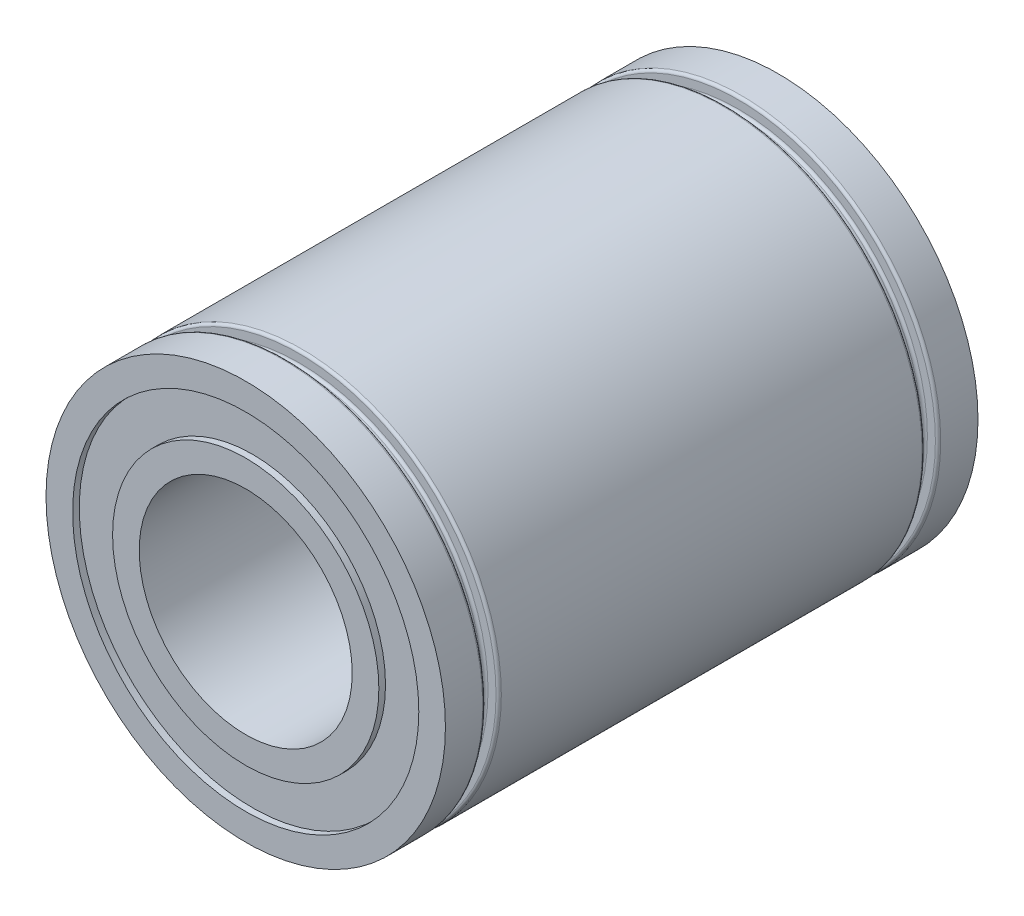
ISO-10303-21;
HEADER;
FILE_DESCRIPTION(('STEP AP214'),'2;1');
FILE_NAME('part.step','',(''),(''),'','','');
FILE_SCHEMA(('AUTOMOTIVE_DESIGN { 1 0 10303 214 1 1 1 1 }'));
ENDSEC;
DATA;
#1=APPLICATION_CONTEXT('core data for automotive mechanical design processes');
#2=APPLICATION_PROTOCOL_DEFINITION('international standard','automotive_design',2000,#1);
#3=PRODUCT_CONTEXT('',#1,'mechanical');
#4=PRODUCT('Part','Part','',(#3));
#5=PRODUCT_RELATED_PRODUCT_CATEGORY('part','',(#4));
#6=PRODUCT_DEFINITION_FORMATION('','',#4);
#7=PRODUCT_DEFINITION_CONTEXT('part definition',#1,'design');
#8=PRODUCT_DEFINITION('design','',#6,#7);
#9=PRODUCT_DEFINITION_SHAPE('','',#8);
#10=(LENGTH_UNIT() NAMED_UNIT(*) SI_UNIT(.MILLI.,.METRE.));
#11=(NAMED_UNIT(*) PLANE_ANGLE_UNIT() SI_UNIT($,.RADIAN.));
#12=(NAMED_UNIT(*) SI_UNIT($,.STERADIAN.) SOLID_ANGLE_UNIT());
#13=UNCERTAINTY_MEASURE_WITH_UNIT(LENGTH_MEASURE(1.E-05),#10,'distance_accuracy_value','');
#14=(GEOMETRIC_REPRESENTATION_CONTEXT(3) GLOBAL_UNCERTAINTY_ASSIGNED_CONTEXT((#13)) GLOBAL_UNIT_ASSIGNED_CONTEXT((#10,
#11,#12)) REPRESENTATION_CONTEXT('',''));
#15=CARTESIAN_POINT('',(0.,0.,0.));
#16=DIRECTION('',(0.,0.,1.));
#17=DIRECTION('',(1.,0.,0.));
#18=AXIS2_PLACEMENT_3D('',#15,#16,#17);
#19=CARTESIAN_POINT('',(0.,0.,10.));
#20=DIRECTION('',(0.,0.,-1.));
#21=DIRECTION('',(-1.,0.,0.));
#22=AXIS2_PLACEMENT_3D('',#19,#20,#21);
#23=CYLINDRICAL_SURFACE('',#22,7.5);
#24=CARTESIAN_POINT('',(0.,0.,-8.6));
#25=DIRECTION('',(0.,0.,1.));
#26=DIRECTION('',(1.,0.,0.));
#27=AXIS2_PLACEMENT_3D('',#24,#25,#26);
#28=CIRCLE('',#27,7.5);
#29=CARTESIAN_POINT('',(7.5,0.,-8.6));
#30=VERTEX_POINT('',#29);
#31=EDGE_CURVE('E84',#30,#30,#28,.F.);
#32=ORIENTED_EDGE('',*,*,#31,.T.);
#33=EDGE_LOOP('',(#32));
#34=FACE_BOUND('',#33,.T.);
#35=CARTESIAN_POINT('',(0.,0.,-10.));
#36=DIRECTION('',(0.,0.,1.));
#37=DIRECTION('',(1.,0.,0.));
#38=AXIS2_PLACEMENT_3D('',#35,#36,#37);
#39=CIRCLE('',#38,7.5);
#40=CARTESIAN_POINT('',(7.5,0.,-10.));
#41=VERTEX_POINT('',#40);
#42=EDGE_CURVE('E124',#41,#41,#39,.T.);
#43=ORIENTED_EDGE('',*,*,#42,.T.);
#44=EDGE_LOOP('',(#43));
#45=FACE_BOUND('',#44,.T.);
#46=ADVANCED_FACE('F43',(#34,#45),#23,.T.);
#47=CARTESIAN_POINT('',(0.,0.,8.6));
#48=DIRECTION('',(0.,0.,-1.));
#49=DIRECTION('',(-1.,0.,0.));
#50=AXIS2_PLACEMENT_3D('',#47,#48,#49);
#51=CIRCLE('',#50,7.5);
#52=CARTESIAN_POINT('',(-7.5,0.,8.6));
#53=VERTEX_POINT('',#52);
#54=EDGE_CURVE('E11',#53,#53,#51,.F.);
#55=ORIENTED_EDGE('',*,*,#54,.T.);
#56=EDGE_LOOP('',(#55));
#57=FACE_BOUND('',#56,.T.);
#58=CARTESIAN_POINT('',(0.,0.,10.));
#59=DIRECTION('',(0.,0.,1.));
#60=DIRECTION('',(1.,0.,0.));
#61=AXIS2_PLACEMENT_3D('',#58,#59,#60);
#62=CIRCLE('',#61,7.5);
#63=CARTESIAN_POINT('',(7.5,0.,10.));
#64=VERTEX_POINT('',#63);
#65=EDGE_CURVE('E123',#64,#64,#62,.T.);
#66=ORIENTED_EDGE('',*,*,#65,.F.);
#67=EDGE_LOOP('',(#66));
#68=FACE_BOUND('',#67,.T.);
#69=ADVANCED_FACE('F145',(#57,#68),#23,.T.);
#70=CARTESIAN_POINT('',(0.,0.,10.));
#71=DIRECTION('',(0.,0.,-1.));
#72=DIRECTION('',(-1.,0.,0.));
#73=AXIS2_PLACEMENT_3D('',#70,#71,#72);
#74=CYLINDRICAL_SURFACE('',#73,5.);
#75=CARTESIAN_POINT('',(0.,0.,-10.));
#76=DIRECTION('',(0.,0.,1.));
#77=DIRECTION('',(1.,0.,0.));
#78=AXIS2_PLACEMENT_3D('',#75,#76,#77);
#79=CIRCLE('',#78,5.);
#80=CARTESIAN_POINT('',(5.,0.,-10.));
#81=VERTEX_POINT('',#80);
#82=EDGE_CURVE('E103',#81,#81,#79,.T.);
#83=ORIENTED_EDGE('',*,*,#82,.T.);
#84=EDGE_LOOP('',(#83));
#85=FACE_BOUND('',#84,.T.);
#86=CARTESIAN_POINT('',(0.,0.,-9.75));
#87=DIRECTION('',(0.,0.,1.));
#88=DIRECTION('',(1.,0.,0.));
#89=AXIS2_PLACEMENT_3D('',#86,#87,#88);
#90=CIRCLE('',#89,5.);
#91=CARTESIAN_POINT('',(5.,0.,-9.75));
#92=VERTEX_POINT('',#91);
#93=EDGE_CURVE('E99',#92,#92,#90,.T.);
#94=ORIENTED_EDGE('',*,*,#93,.F.);
#95=EDGE_LOOP('',(#94));
#96=FACE_BOUND('',#95,.T.);
#97=ADVANCED_FACE('F147',(#85,#96),#74,.T.);
#98=CARTESIAN_POINT('',(0.,0.,10.));
#99=DIRECTION('',(0.,0.,-1.));
#100=DIRECTION('',(-1.,0.,0.));
#101=AXIS2_PLACEMENT_3D('',#98,#99,#100);
#102=CYLINDRICAL_SURFACE('',#101,4.);
#103=CARTESIAN_POINT('',(0.,0.,10.));
#104=DIRECTION('',(0.,0.,1.));
#105=DIRECTION('',(1.,0.,0.));
#106=AXIS2_PLACEMENT_3D('',#103,#104,#105);
#107=CIRCLE('',#106,4.);
#108=CARTESIAN_POINT('',(4.,0.,10.));
#109=VERTEX_POINT('',#108);
#110=EDGE_CURVE('E106',#109,#109,#107,.T.);
#111=ORIENTED_EDGE('',*,*,#110,.T.);
#112=EDGE_LOOP('',(#111));
#113=FACE_BOUND('',#112,.T.);
#114=CARTESIAN_POINT('',(0.,0.,-10.));
#115=DIRECTION('',(0.,0.,1.));
#116=DIRECTION('',(1.,0.,0.));
#117=AXIS2_PLACEMENT_3D('',#114,#115,#116);
#118=CIRCLE('',#117,4.);
#119=CARTESIAN_POINT('',(4.,0.,-10.));
#120=VERTEX_POINT('',#119);
#121=EDGE_CURVE('E107',#120,#120,#118,.T.);
#122=ORIENTED_EDGE('',*,*,#121,.F.);
#123=EDGE_LOOP('',(#122));
#124=FACE_BOUND('',#123,.T.);
#125=ADVANCED_FACE('F154',(#113,#124),#102,.F.);
#126=CARTESIAN_POINT('',(0.,0.,9.75));
#127=DIRECTION('',(0.,0.,1.));
#128=DIRECTION('',(1.,0.,0.));
#129=AXIS2_PLACEMENT_3D('',#126,#127,#128);
#130=CIRCLE('',#129,5.);
#131=CARTESIAN_POINT('',(5.,0.,9.75));
#132=VERTEX_POINT('',#131);
#133=EDGE_CURVE('E110',#132,#132,#130,.T.);
#134=ORIENTED_EDGE('',*,*,#133,.T.);
#135=EDGE_LOOP('',(#134));
#136=FACE_BOUND('',#135,.T.);
#137=CARTESIAN_POINT('',(0.,0.,10.));
#138=DIRECTION('',(0.,0.,1.));
#139=DIRECTION('',(1.,0.,0.));
#140=AXIS2_PLACEMENT_3D('',#137,#138,#139);
#141=CIRCLE('',#140,5.);
#142=CARTESIAN_POINT('',(5.,0.,10.));
#143=VERTEX_POINT('',#142);
#144=EDGE_CURVE('E102',#143,#143,#141,.T.);
#145=ORIENTED_EDGE('',*,*,#144,.F.);
#146=EDGE_LOOP('',(#145));
#147=FACE_BOUND('',#146,.T.);
#148=ADVANCED_FACE('F157',(#136,#147),#74,.T.);
#149=CARTESIAN_POINT('',(0.,0.,10.));
#150=DIRECTION('',(0.,0.,1.));
#151=DIRECTION('',(1.,0.,0.));
#152=AXIS2_PLACEMENT_3D('',#149,#150,#151);
#153=PLANE('',#152);
#154=ORIENTED_EDGE('',*,*,#110,.F.);
#155=EDGE_LOOP('',(#154));
#156=FACE_BOUND('',#155,.T.);
#157=ORIENTED_EDGE('',*,*,#144,.T.);
#158=EDGE_LOOP('',(#157));
#159=FACE_BOUND('',#158,.T.);
#160=ADVANCED_FACE('F378',(#156,#159),#153,.T.);
#161=CARTESIAN_POINT('',(0.,0.,-10.));
#162=DIRECTION('',(0.,0.,1.));
#163=DIRECTION('',(1.,0.,0.));
#164=AXIS2_PLACEMENT_3D('',#161,#162,#163);
#165=PLANE('',#164);
#166=ORIENTED_EDGE('',*,*,#121,.T.);
#167=EDGE_LOOP('',(#166));
#168=FACE_BOUND('',#167,.T.);
#169=ORIENTED_EDGE('',*,*,#82,.F.);
#170=EDGE_LOOP('',(#169));
#171=FACE_BOUND('',#170,.T.);
#172=ADVANCED_FACE('F341',(#168,#171),#165,.F.);
#173=CARTESIAN_POINT('',(0.,0.,9.75));
#174=DIRECTION('',(0.,0.,1.));
#175=DIRECTION('',(1.,0.,0.));
#176=AXIS2_PLACEMENT_3D('',#173,#174,#175);
#177=PLANE('',#176);
#178=ORIENTED_EDGE('',*,*,#133,.F.);
#179=EDGE_LOOP('',(#178));
#180=FACE_BOUND('',#179,.T.);
#181=CARTESIAN_POINT('',(0.,0.,9.75));
#182=DIRECTION('',(0.,0.,1.));
#183=DIRECTION('',(1.,0.,0.));
#184=AXIS2_PLACEMENT_3D('',#181,#182,#183);
#185=CIRCLE('',#184,6.5);
#186=CARTESIAN_POINT('',(6.5,0.,9.75));
#187=VERTEX_POINT('',#186);
#188=EDGE_CURVE('E118',#187,#187,#185,.F.);
#189=ORIENTED_EDGE('',*,*,#188,.F.);
#190=EDGE_LOOP('',(#189));
#191=FACE_BOUND('',#190,.T.);
#192=ADVANCED_FACE('F331',(#180,#191),#177,.T.);
#193=CARTESIAN_POINT('',(0.,0.,-9.75));
#194=DIRECTION('',(0.,0.,1.));
#195=DIRECTION('',(1.,0.,0.));
#196=AXIS2_PLACEMENT_3D('',#193,#194,#195);
#197=PLANE('',#196);
#198=ORIENTED_EDGE('',*,*,#93,.T.);
#199=EDGE_LOOP('',(#198));
#200=FACE_BOUND('',#199,.T.);
#201=CARTESIAN_POINT('',(0.,0.,-9.75));
#202=DIRECTION('',(0.,0.,1.));
#203=DIRECTION('',(1.,0.,0.));
#204=AXIS2_PLACEMENT_3D('',#201,#202,#203);
#205=CIRCLE('',#204,6.5);
#206=CARTESIAN_POINT('',(6.5,0.,-9.75));
#207=VERTEX_POINT('',#206);
#208=EDGE_CURVE('E115',#207,#207,#205,.T.);
#209=ORIENTED_EDGE('',*,*,#208,.F.);
#210=EDGE_LOOP('',(#209));
#211=FACE_BOUND('',#210,.T.);
#212=ADVANCED_FACE('F324',(#200,#211),#197,.F.);
#213=CARTESIAN_POINT('',(0.,0.,10.));
#214=DIRECTION('',(0.,0.,-1.));
#215=DIRECTION('',(-1.,0.,0.));
#216=AXIS2_PLACEMENT_3D('',#213,#214,#215);
#217=CYLINDRICAL_SURFACE('',#216,6.5);
#218=CARTESIAN_POINT('',(0.,0.,-10.));
#219=DIRECTION('',(0.,0.,1.));
#220=DIRECTION('',(1.,0.,0.));
#221=AXIS2_PLACEMENT_3D('',#218,#219,#220);
#222=CIRCLE('',#221,6.5);
#223=CARTESIAN_POINT('',(6.5,0.,-10.));
#224=VERTEX_POINT('',#223);
#225=EDGE_CURVE('E128',#224,#224,#222,.T.);
#226=ORIENTED_EDGE('',*,*,#225,.F.);
#227=EDGE_LOOP('',(#226));
#228=FACE_BOUND('',#227,.T.);
#229=ORIENTED_EDGE('',*,*,#208,.T.);
#230=EDGE_LOOP('',(#229));
#231=FACE_BOUND('',#230,.T.);
#232=ADVANCED_FACE('F330',(#228,#231),#217,.F.);
#233=ORIENTED_EDGE('',*,*,#188,.T.);
#234=EDGE_LOOP('',(#233));
#235=FACE_BOUND('',#234,.T.);
#236=CARTESIAN_POINT('',(0.,0.,10.));
#237=DIRECTION('',(0.,0.,1.));
#238=DIRECTION('',(1.,0.,0.));
#239=AXIS2_PLACEMENT_3D('',#236,#237,#238);
#240=CIRCLE('',#239,6.5);
#241=CARTESIAN_POINT('',(6.5,0.,10.));
#242=VERTEX_POINT('',#241);
#243=EDGE_CURVE('E127',#242,#242,#240,.T.);
#244=ORIENTED_EDGE('',*,*,#243,.T.);
#245=EDGE_LOOP('',(#244));
#246=FACE_BOUND('',#245,.T.);
#247=ADVANCED_FACE('F136',(#235,#246),#217,.F.);
#248=CARTESIAN_POINT('',(0.,0.,10.));
#249=DIRECTION('',(0.,0.,1.));
#250=DIRECTION('',(1.,0.,0.));
#251=AXIS2_PLACEMENT_3D('',#248,#249,#250);
#252=PLANE('',#251);
#253=ORIENTED_EDGE('',*,*,#243,.F.);
#254=EDGE_LOOP('',(#253));
#255=FACE_BOUND('',#254,.T.);
#256=ORIENTED_EDGE('',*,*,#65,.T.);
#257=EDGE_LOOP('',(#256));
#258=FACE_BOUND('',#257,.T.);
#259=ADVANCED_FACE('F138',(#255,#258),#252,.T.);
#260=CARTESIAN_POINT('',(0.,0.,-10.));
#261=DIRECTION('',(0.,0.,1.));
#262=DIRECTION('',(1.,0.,0.));
#263=AXIS2_PLACEMENT_3D('',#260,#261,#262);
#264=PLANE('',#263);
#265=ORIENTED_EDGE('',*,*,#225,.T.);
#266=EDGE_LOOP('',(#265));
#267=FACE_BOUND('',#266,.T.);
#268=ORIENTED_EDGE('',*,*,#42,.F.);
#269=EDGE_LOOP('',(#268));
#270=FACE_BOUND('',#269,.T.);
#271=ADVANCED_FACE('F141',(#267,#270),#264,.F.);
#272=CARTESIAN_POINT('',(7.,0.,8.));
#273=DIRECTION('',(0.,0.,1.));
#274=DIRECTION('',(1.,0.,0.));
#275=AXIS2_PLACEMENT_3D('',#272,#273,#274);
#276=PLANE('',#275);
#277=CARTESIAN_POINT('',(0.,0.,8.));
#278=DIRECTION('',(0.,0.,1.));
#279=DIRECTION('',(1.,0.,0.));
#280=AXIS2_PLACEMENT_3D('',#277,#278,#279);
#281=CIRCLE('',#280,7.1);
#282=CARTESIAN_POINT('',(7.1,0.,8.));
#283=VERTEX_POINT('',#282);
#284=EDGE_CURVE('E50',#283,#283,#281,.F.);
#285=ORIENTED_EDGE('',*,*,#284,.T.);
#286=EDGE_LOOP('',(#285));
#287=FACE_BOUND('',#286,.T.);
#288=CARTESIAN_POINT('',(0.,0.,8.));
#289=DIRECTION('',(0.,0.,1.));
#290=DIRECTION('',(1.,0.,0.));
#291=AXIS2_PLACEMENT_3D('',#288,#289,#290);
#292=CIRCLE('',#291,7.4);
#293=CARTESIAN_POINT('',(7.4,0.,8.));
#294=VERTEX_POINT('',#293);
#295=EDGE_CURVE('E54',#294,#294,#292,.T.);
#296=ORIENTED_EDGE('',*,*,#295,.T.);
#297=EDGE_LOOP('',(#296));
#298=FACE_BOUND('',#297,.T.);
#299=ADVANCED_FACE('F185',(#287,#298),#276,.T.);
#300=CARTESIAN_POINT('',(7.,0.,8.5));
#301=DIRECTION('',(0.,0.,-1.));
#302=DIRECTION('',(-1.,0.,0.));
#303=AXIS2_PLACEMENT_3D('',#300,#301,#302);
#304=PLANE('',#303);
#305=CARTESIAN_POINT('',(0.,0.,8.5));
#306=DIRECTION('',(0.,0.,-1.));
#307=DIRECTION('',(-1.,0.,0.));
#308=AXIS2_PLACEMENT_3D('',#305,#306,#307);
#309=CIRCLE('',#308,7.1);
#310=CARTESIAN_POINT('',(-7.1,0.,8.5));
#311=VERTEX_POINT('',#310);
#312=EDGE_CURVE('E58',#311,#311,#309,.F.);
#313=ORIENTED_EDGE('',*,*,#312,.T.);
#314=EDGE_LOOP('',(#313));
#315=FACE_BOUND('',#314,.T.);
#316=CARTESIAN_POINT('',(0.,0.,8.5));
#317=DIRECTION('',(0.,0.,-1.));
#318=DIRECTION('',(-1.,0.,0.));
#319=AXIS2_PLACEMENT_3D('',#316,#317,#318);
#320=CIRCLE('',#319,7.4);
#321=CARTESIAN_POINT('',(-7.4,0.,8.5));
#322=VERTEX_POINT('',#321);
#323=EDGE_CURVE('E63',#322,#322,#320,.T.);
#324=ORIENTED_EDGE('',*,*,#323,.T.);
#325=EDGE_LOOP('',(#324));
#326=FACE_BOUND('',#325,.T.);
#327=ADVANCED_FACE('F172',(#315,#326),#304,.T.);
#328=CARTESIAN_POINT('',(0.,0.,-10.));
#329=DIRECTION('',(0.,0.,-1.));
#330=DIRECTION('',(-1.,0.,0.));
#331=AXIS2_PLACEMENT_3D('',#328,#329,#330);
#332=CYLINDRICAL_SURFACE('',#331,7.);
#333=CARTESIAN_POINT('',(0.,0.,8.4));
#334=DIRECTION('',(0.,0.,-1.));
#335=DIRECTION('',(-1.,0.,0.));
#336=AXIS2_PLACEMENT_3D('',#333,#334,#335);
#337=CIRCLE('',#336,7.);
#338=CARTESIAN_POINT('',(-7.,0.,8.4));
#339=VERTEX_POINT('',#338);
#340=EDGE_CURVE('E66',#339,#339,#337,.T.);
#341=ORIENTED_EDGE('',*,*,#340,.T.);
#342=EDGE_LOOP('',(#341));
#343=FACE_BOUND('',#342,.T.);
#344=CARTESIAN_POINT('',(0.,0.,8.1));
#345=DIRECTION('',(0.,0.,1.));
#346=DIRECTION('',(1.,0.,0.));
#347=AXIS2_PLACEMENT_3D('',#344,#345,#346);
#348=CIRCLE('',#347,7.);
#349=CARTESIAN_POINT('',(7.,0.,8.1));
#350=VERTEX_POINT('',#349);
#351=EDGE_CURVE('E69',#350,#350,#348,.T.);
#352=ORIENTED_EDGE('',*,*,#351,.T.);
#353=EDGE_LOOP('',(#352));
#354=FACE_BOUND('',#353,.T.);
#355=ADVANCED_FACE('F163',(#343,#354),#332,.T.);
#356=CARTESIAN_POINT('',(0.,0.,-7.9));
#357=DIRECTION('',(0.,0.,-1.));
#358=DIRECTION('',(-1.,0.,0.));
#359=AXIS2_PLACEMENT_3D('',#356,#357,#358);
#360=CIRCLE('',#359,7.5);
#361=CARTESIAN_POINT('',(-7.5,0.,-7.9));
#362=VERTEX_POINT('',#361);
#363=EDGE_CURVE('E72',#362,#362,#360,.F.);
#364=ORIENTED_EDGE('',*,*,#363,.T.);
#365=EDGE_LOOP('',(#364));
#366=FACE_BOUND('',#365,.T.);
#367=CARTESIAN_POINT('',(0.,0.,7.9));
#368=DIRECTION('',(0.,0.,1.));
#369=DIRECTION('',(1.,0.,0.));
#370=AXIS2_PLACEMENT_3D('',#367,#368,#369);
#371=CIRCLE('',#370,7.5);
#372=CARTESIAN_POINT('',(7.5,0.,7.9));
#373=VERTEX_POINT('',#372);
#374=EDGE_CURVE('E75',#373,#373,#371,.F.);
#375=ORIENTED_EDGE('',*,*,#374,.T.);
#376=EDGE_LOOP('',(#375));
#377=FACE_BOUND('',#376,.T.);
#378=ADVANCED_FACE('F149',(#366,#377),#23,.T.);
#379=CARTESIAN_POINT('',(7.,0.,-8.5));
#380=DIRECTION('',(0.,0.,1.));
#381=DIRECTION('',(1.,0.,0.));
#382=AXIS2_PLACEMENT_3D('',#379,#380,#381);
#383=PLANE('',#382);
#384=CARTESIAN_POINT('',(0.,0.,-8.5));
#385=DIRECTION('',(0.,0.,1.));
#386=DIRECTION('',(1.,0.,0.));
#387=AXIS2_PLACEMENT_3D('',#384,#385,#386);
#388=CIRCLE('',#387,7.1);
#389=CARTESIAN_POINT('',(7.1,0.,-8.5));
#390=VERTEX_POINT('',#389);
#391=EDGE_CURVE('E93',#390,#390,#388,.F.);
#392=ORIENTED_EDGE('',*,*,#391,.T.);
#393=EDGE_LOOP('',(#392));
#394=FACE_BOUND('',#393,.T.);
#395=CARTESIAN_POINT('',(0.,0.,-8.5));
#396=DIRECTION('',(0.,0.,1.));
#397=DIRECTION('',(1.,0.,0.));
#398=AXIS2_PLACEMENT_3D('',#395,#396,#397);
#399=CIRCLE('',#398,7.4);
#400=CARTESIAN_POINT('',(7.4,0.,-8.5));
#401=VERTEX_POINT('',#400);
#402=EDGE_CURVE('E96',#401,#401,#399,.T.);
#403=ORIENTED_EDGE('',*,*,#402,.T.);
#404=EDGE_LOOP('',(#403));
#405=FACE_BOUND('',#404,.T.);
#406=ADVANCED_FACE('F162',(#394,#405),#383,.T.);
#407=CARTESIAN_POINT('',(7.,0.,-8.));
#408=DIRECTION('',(0.,0.,-1.));
#409=DIRECTION('',(-1.,0.,0.));
#410=AXIS2_PLACEMENT_3D('',#407,#408,#409);
#411=PLANE('',#410);
#412=CARTESIAN_POINT('',(0.,0.,-8.));
#413=DIRECTION('',(0.,0.,-1.));
#414=DIRECTION('',(-1.,0.,0.));
#415=AXIS2_PLACEMENT_3D('',#412,#413,#414);
#416=CIRCLE('',#415,7.1);
#417=CARTESIAN_POINT('',(-7.1,0.,-8.));
#418=VERTEX_POINT('',#417);
#419=EDGE_CURVE('E78',#418,#418,#416,.F.);
#420=ORIENTED_EDGE('',*,*,#419,.T.);
#421=EDGE_LOOP('',(#420));
#422=FACE_BOUND('',#421,.T.);
#423=CARTESIAN_POINT('',(0.,0.,-8.));
#424=DIRECTION('',(0.,0.,-1.));
#425=DIRECTION('',(-1.,0.,0.));
#426=AXIS2_PLACEMENT_3D('',#423,#424,#425);
#427=CIRCLE('',#426,7.4);
#428=CARTESIAN_POINT('',(-7.4,0.,-8.));
#429=VERTEX_POINT('',#428);
#430=EDGE_CURVE('E81',#429,#429,#427,.T.);
#431=ORIENTED_EDGE('',*,*,#430,.T.);
#432=EDGE_LOOP('',(#431));
#433=FACE_BOUND('',#432,.T.);
#434=ADVANCED_FACE('F169',(#422,#433),#411,.T.);
#435=CARTESIAN_POINT('',(0.,0.,-10.));
#436=DIRECTION('',(0.,0.,-1.));
#437=DIRECTION('',(-1.,0.,0.));
#438=AXIS2_PLACEMENT_3D('',#435,#436,#437);
#439=CYLINDRICAL_SURFACE('',#438,7.);
#440=CARTESIAN_POINT('',(0.,0.,-8.4));
#441=DIRECTION('',(0.,0.,1.));
#442=DIRECTION('',(1.,0.,0.));
#443=AXIS2_PLACEMENT_3D('',#440,#441,#442);
#444=CIRCLE('',#443,7.);
#445=CARTESIAN_POINT('',(7.,0.,-8.4));
#446=VERTEX_POINT('',#445);
#447=EDGE_CURVE('E87',#446,#446,#444,.T.);
#448=ORIENTED_EDGE('',*,*,#447,.T.);
#449=EDGE_LOOP('',(#448));
#450=FACE_BOUND('',#449,.T.);
#451=CARTESIAN_POINT('',(0.,0.,-8.1));
#452=DIRECTION('',(0.,0.,-1.));
#453=DIRECTION('',(-1.,0.,0.));
#454=AXIS2_PLACEMENT_3D('',#451,#452,#453);
#455=CIRCLE('',#454,7.);
#456=CARTESIAN_POINT('',(-7.,0.,-8.1));
#457=VERTEX_POINT('',#456);
#458=EDGE_CURVE('E90',#457,#457,#455,.T.);
#459=ORIENTED_EDGE('',*,*,#458,.T.);
#460=EDGE_LOOP('',(#459));
#461=FACE_BOUND('',#460,.T.);
#462=ADVANCED_FACE('F196',(#450,#461),#439,.T.);
#463=CARTESIAN_POINT('',(0.,0.,-8.4));
#464=DIRECTION('',(0.,0.,1.));
#465=DIRECTION('',(1.,0.,0.));
#466=AXIS2_PLACEMENT_3D('',#463,#464,#465);
#467=TOROIDAL_SURFACE('',#466,7.1,0.1);
#468=ORIENTED_EDGE('',*,*,#447,.F.);
#469=EDGE_LOOP('',(#468));
#470=FACE_BOUND('',#469,.T.);
#471=ORIENTED_EDGE('',*,*,#391,.F.);
#472=EDGE_LOOP('',(#471));
#473=FACE_BOUND('',#472,.T.);
#474=ADVANCED_FACE('F199',(#470,#473),#467,.F.);
#475=CARTESIAN_POINT('',(0.,0.,-8.6));
#476=DIRECTION('',(0.,0.,1.));
#477=DIRECTION('',(1.,0.,0.));
#478=AXIS2_PLACEMENT_3D('',#475,#476,#477);
#479=TOROIDAL_SURFACE('',#478,7.4,0.1);
#480=ORIENTED_EDGE('',*,*,#31,.F.);
#481=EDGE_LOOP('',(#480));
#482=FACE_BOUND('',#481,.T.);
#483=ORIENTED_EDGE('',*,*,#402,.F.);
#484=EDGE_LOOP('',(#483));
#485=FACE_BOUND('',#484,.T.);
#486=ADVANCED_FACE('F221',(#482,#485),#479,.T.);
#487=CARTESIAN_POINT('',(0.,0.,-8.1));
#488=DIRECTION('',(0.,0.,-1.));
#489=DIRECTION('',(-1.,0.,0.));
#490=AXIS2_PLACEMENT_3D('',#487,#488,#489);
#491=TOROIDAL_SURFACE('',#490,7.1,0.1);
#492=ORIENTED_EDGE('',*,*,#419,.F.);
#493=EDGE_LOOP('',(#492));
#494=FACE_BOUND('',#493,.T.);
#495=ORIENTED_EDGE('',*,*,#458,.F.);
#496=EDGE_LOOP('',(#495));
#497=FACE_BOUND('',#496,.T.);
#498=ADVANCED_FACE('F212',(#494,#497),#491,.F.);
#499=CARTESIAN_POINT('',(0.,0.,-7.9));
#500=DIRECTION('',(0.,0.,-1.));
#501=DIRECTION('',(-1.,0.,0.));
#502=AXIS2_PLACEMENT_3D('',#499,#500,#501);
#503=TOROIDAL_SURFACE('',#502,7.4,0.1);
#504=ORIENTED_EDGE('',*,*,#363,.F.);
#505=EDGE_LOOP('',(#504));
#506=FACE_BOUND('',#505,.T.);
#507=ORIENTED_EDGE('',*,*,#430,.F.);
#508=EDGE_LOOP('',(#507));
#509=FACE_BOUND('',#508,.T.);
#510=ADVANCED_FACE('F209',(#506,#509),#503,.T.);
#511=CARTESIAN_POINT('',(0.,0.,8.4));
#512=DIRECTION('',(0.,0.,-1.));
#513=DIRECTION('',(-1.,0.,0.));
#514=AXIS2_PLACEMENT_3D('',#511,#512,#513);
#515=TOROIDAL_SURFACE('',#514,7.1,0.1);
#516=ORIENTED_EDGE('',*,*,#312,.F.);
#517=EDGE_LOOP('',(#516));
#518=FACE_BOUND('',#517,.T.);
#519=ORIENTED_EDGE('',*,*,#340,.F.);
#520=EDGE_LOOP('',(#519));
#521=FACE_BOUND('',#520,.T.);
#522=ADVANCED_FACE('F211',(#518,#521),#515,.F.);
#523=CARTESIAN_POINT('',(0.,0.,8.1));
#524=DIRECTION('',(0.,0.,1.));
#525=DIRECTION('',(1.,0.,0.));
#526=AXIS2_PLACEMENT_3D('',#523,#524,#525);
#527=TOROIDAL_SURFACE('',#526,7.1,0.1);
#528=ORIENTED_EDGE('',*,*,#351,.F.);
#529=EDGE_LOOP('',(#528));
#530=FACE_BOUND('',#529,.T.);
#531=ORIENTED_EDGE('',*,*,#284,.F.);
#532=EDGE_LOOP('',(#531));
#533=FACE_BOUND('',#532,.T.);
#534=ADVANCED_FACE('F182',(#530,#533),#527,.F.);
#535=CARTESIAN_POINT('',(0.,0.,7.9));
#536=DIRECTION('',(0.,0.,1.));
#537=DIRECTION('',(1.,0.,0.));
#538=AXIS2_PLACEMENT_3D('',#535,#536,#537);
#539=TOROIDAL_SURFACE('',#538,7.4,0.1);
#540=ORIENTED_EDGE('',*,*,#374,.F.);
#541=EDGE_LOOP('',(#540));
#542=FACE_BOUND('',#541,.T.);
#543=ORIENTED_EDGE('',*,*,#295,.F.);
#544=EDGE_LOOP('',(#543));
#545=FACE_BOUND('',#544,.T.);
#546=ADVANCED_FACE('F179',(#542,#545),#539,.T.);
#547=CARTESIAN_POINT('',(0.,0.,8.6));
#548=DIRECTION('',(0.,0.,-1.));
#549=DIRECTION('',(-1.,0.,0.));
#550=AXIS2_PLACEMENT_3D('',#547,#548,#549);
#551=TOROIDAL_SURFACE('',#550,7.4,0.1);
#552=ORIENTED_EDGE('',*,*,#54,.F.);
#553=EDGE_LOOP('',(#552));
#554=FACE_BOUND('',#553,.T.);
#555=ORIENTED_EDGE('',*,*,#323,.F.);
#556=EDGE_LOOP('',(#555));
#557=FACE_BOUND('',#556,.T.);
#558=ADVANCED_FACE('F45',(#554,#557),#551,.T.);
#559=CLOSED_SHELL('',(#46,#69,#97,#125,#148,#160,#172,#192,#212,#232,#247,#259,#271,#299,#327,
#355,#378,#406,#434,#462,#474,#486,#498,#510,#522,#534,#546,#558));
#560=MANIFOLD_SOLID_BREP('B2',#559);
#561=ADVANCED_BREP_SHAPE_REPRESENTATION('',(#18,#560),#14);
#562=SHAPE_DEFINITION_REPRESENTATION(#9,#561);
ENDSEC;
END-ISO-10303-21;
